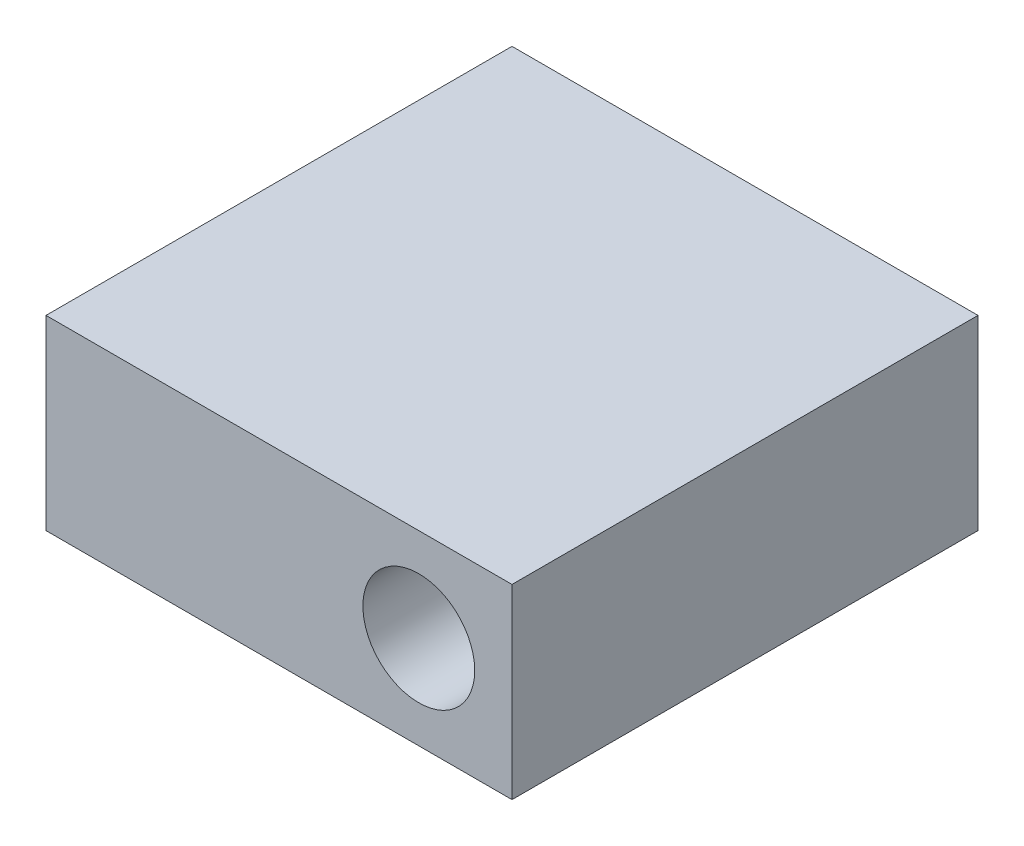
ISO-10303-21;
HEADER;
FILE_DESCRIPTION(('STEP AP214'),'2;1');
FILE_NAME('part.step','',(''),(''),'','','');
FILE_SCHEMA(('AUTOMOTIVE_DESIGN { 1 0 10303 214 1 1 1 1 }'));
ENDSEC;
DATA;
#1=APPLICATION_CONTEXT('core data for automotive mechanical design processes');
#2=APPLICATION_PROTOCOL_DEFINITION('international standard','automotive_design',2000,#1);
#3=PRODUCT_CONTEXT('',#1,'mechanical');
#4=PRODUCT('Part','Part','',(#3));
#5=PRODUCT_RELATED_PRODUCT_CATEGORY('part','',(#4));
#6=PRODUCT_DEFINITION_FORMATION('','',#4);
#7=PRODUCT_DEFINITION_CONTEXT('part definition',#1,'design');
#8=PRODUCT_DEFINITION('design','',#6,#7);
#9=PRODUCT_DEFINITION_SHAPE('','',#8);
#10=(LENGTH_UNIT() NAMED_UNIT(*) SI_UNIT(.MILLI.,.METRE.));
#11=(NAMED_UNIT(*) PLANE_ANGLE_UNIT() SI_UNIT($,.RADIAN.));
#12=(NAMED_UNIT(*) SI_UNIT($,.STERADIAN.) SOLID_ANGLE_UNIT());
#13=UNCERTAINTY_MEASURE_WITH_UNIT(LENGTH_MEASURE(1.E-05),#10,'distance_accuracy_value','');
#14=(GEOMETRIC_REPRESENTATION_CONTEXT(3) GLOBAL_UNCERTAINTY_ASSIGNED_CONTEXT((#13)) GLOBAL_UNIT_ASSIGNED_CONTEXT((#10,
#11,#12)) REPRESENTATION_CONTEXT('',''));
#15=CARTESIAN_POINT('',(0.,0.,0.));
#16=DIRECTION('',(0.,0.,1.));
#17=DIRECTION('',(1.,0.,0.));
#18=AXIS2_PLACEMENT_3D('',#15,#16,#17);
#19=CARTESIAN_POINT('',(12.5,10.,12.5));
#20=DIRECTION('',(-1.,0.,0.));
#21=DIRECTION('',(0.,0.,1.));
#22=AXIS2_PLACEMENT_3D('',#19,#20,#21);
#23=PLANE('',#22);
#24=DIRECTION('',(0.,0.,-1.));
#25=VECTOR('',#24,1.);
#26=CARTESIAN_POINT('',(12.5,0.,12.5));
#27=LINE('',#26,#25);
#28=CARTESIAN_POINT('',(12.5,0.,12.5));
#29=VERTEX_POINT('',#28);
#30=CARTESIAN_POINT('',(12.5,0.,-12.5));
#31=VERTEX_POINT('',#30);
#32=EDGE_CURVE('E107',#29,#31,#27,.T.);
#33=ORIENTED_EDGE('',*,*,#32,.T.);
#34=DIRECTION('',(0.,-1.,0.));
#35=VECTOR('',#34,1.);
#36=CARTESIAN_POINT('',(12.5,10.,-12.5));
#37=LINE('',#36,#35);
#38=CARTESIAN_POINT('',(12.5,10.,-12.5));
#39=VERTEX_POINT('',#38);
#40=EDGE_CURVE('E11',#39,#31,#37,.T.);
#41=ORIENTED_EDGE('',*,*,#40,.F.);
#42=DIRECTION('',(0.,0.,-1.));
#43=VECTOR('',#42,1.);
#44=CARTESIAN_POINT('',(12.5,10.,12.5));
#45=LINE('',#44,#43);
#46=CARTESIAN_POINT('',(12.5,10.,12.5));
#47=VERTEX_POINT('',#46);
#48=EDGE_CURVE('E91',#47,#39,#45,.T.);
#49=ORIENTED_EDGE('',*,*,#48,.F.);
#50=DIRECTION('',(0.,-1.,0.));
#51=VECTOR('',#50,1.);
#52=CARTESIAN_POINT('',(12.5,10.,12.5));
#53=LINE('',#52,#51);
#54=EDGE_CURVE('E103',#47,#29,#53,.T.);
#55=ORIENTED_EDGE('',*,*,#54,.T.);
#56=EDGE_LOOP('',(#33,#41,#49,#55));
#57=FACE_BOUND('',#56,.T.);
#58=ADVANCED_FACE('F39',(#57),#23,.F.);
#59=CARTESIAN_POINT('',(-12.5,10.,-12.5));
#60=DIRECTION('',(0.,0.,1.));
#61=DIRECTION('',(1.,0.,0.));
#62=AXIS2_PLACEMENT_3D('',#59,#60,#61);
#63=PLANE('',#62);
#64=DIRECTION('',(-1.,0.,0.));
#65=VECTOR('',#64,1.);
#66=CARTESIAN_POINT('',(-12.5,0.,-12.5));
#67=LINE('',#66,#65);
#68=CARTESIAN_POINT('',(-12.5,0.,-12.5));
#69=VERTEX_POINT('',#68);
#70=EDGE_CURVE('E96',#31,#69,#67,.T.);
#71=ORIENTED_EDGE('',*,*,#70,.T.);
#72=DIRECTION('',(0.,-1.,0.));
#73=VECTOR('',#72,1.);
#74=CARTESIAN_POINT('',(-12.5,10.,-12.5));
#75=LINE('',#74,#73);
#76=CARTESIAN_POINT('',(-12.5,10.,-12.5));
#77=VERTEX_POINT('',#76);
#78=EDGE_CURVE('E48',#77,#69,#75,.T.);
#79=ORIENTED_EDGE('',*,*,#78,.F.);
#80=DIRECTION('',(-1.,0.,0.));
#81=VECTOR('',#80,1.);
#82=CARTESIAN_POINT('',(-12.5,10.,-12.5));
#83=LINE('',#82,#81);
#84=EDGE_CURVE('E86',#39,#77,#83,.T.);
#85=ORIENTED_EDGE('',*,*,#84,.F.);
#86=ORIENTED_EDGE('',*,*,#40,.T.);
#87=EDGE_LOOP('',(#71,#79,#85,#86));
#88=FACE_BOUND('',#87,.T.);
#89=ADVANCED_FACE('F95',(#88),#63,.F.);
#90=CARTESIAN_POINT('',(-12.5,10.,12.5));
#91=DIRECTION('',(1.,0.,0.));
#92=DIRECTION('',(0.,0.,-1.));
#93=AXIS2_PLACEMENT_3D('',#90,#91,#92);
#94=PLANE('',#93);
#95=DIRECTION('',(0.,0.,1.));
#96=VECTOR('',#95,1.);
#97=CARTESIAN_POINT('',(-12.5,0.,12.5));
#98=LINE('',#97,#96);
#99=CARTESIAN_POINT('',(-12.5,0.,12.5));
#100=VERTEX_POINT('',#99);
#101=EDGE_CURVE('E73',#69,#100,#98,.T.);
#102=ORIENTED_EDGE('',*,*,#101,.T.);
#103=DIRECTION('',(0.,-1.,0.));
#104=VECTOR('',#103,1.);
#105=CARTESIAN_POINT('',(-12.5,10.,12.5));
#106=LINE('',#105,#104);
#107=CARTESIAN_POINT('',(-12.5,10.,12.5));
#108=VERTEX_POINT('',#107);
#109=EDGE_CURVE('E98',#108,#100,#106,.T.);
#110=ORIENTED_EDGE('',*,*,#109,.F.);
#111=DIRECTION('',(0.,0.,1.));
#112=VECTOR('',#111,1.);
#113=CARTESIAN_POINT('',(-12.5,10.,12.5));
#114=LINE('',#113,#112);
#115=EDGE_CURVE('E89',#77,#108,#114,.T.);
#116=ORIENTED_EDGE('',*,*,#115,.F.);
#117=ORIENTED_EDGE('',*,*,#78,.T.);
#118=EDGE_LOOP('',(#102,#110,#116,#117));
#119=FACE_BOUND('',#118,.T.);
#120=ADVANCED_FACE('F99',(#119),#94,.F.);
#121=CARTESIAN_POINT('',(-12.5,10.,12.5));
#122=DIRECTION('',(0.,0.,-1.));
#123=DIRECTION('',(-1.,0.,0.));
#124=AXIS2_PLACEMENT_3D('',#121,#122,#123);
#125=PLANE('',#124);
#126=CARTESIAN_POINT('',(7.5,5.,12.5));
#127=DIRECTION('',(0.,0.,1.));
#128=DIRECTION('',(1.,0.,0.));
#129=AXIS2_PLACEMENT_3D('',#126,#127,#128);
#130=CIRCLE('',#129,3.);
#131=CARTESIAN_POINT('',(10.5,5.,12.5));
#132=VERTEX_POINT('',#131);
#133=EDGE_CURVE('E128',#132,#132,#130,.T.);
#134=ORIENTED_EDGE('',*,*,#133,.F.);
#135=EDGE_LOOP('',(#134));
#136=FACE_BOUND('',#135,.T.);
#137=DIRECTION('',(1.,0.,0.));
#138=VECTOR('',#137,1.);
#139=CARTESIAN_POINT('',(-12.5,0.,12.5));
#140=LINE('',#139,#138);
#141=EDGE_CURVE('E79',#100,#29,#140,.T.);
#142=ORIENTED_EDGE('',*,*,#141,.T.);
#143=ORIENTED_EDGE('',*,*,#54,.F.);
#144=DIRECTION('',(1.,0.,0.));
#145=VECTOR('',#144,1.);
#146=CARTESIAN_POINT('',(-12.5,10.,12.5));
#147=LINE('',#146,#145);
#148=EDGE_CURVE('E56',#108,#47,#147,.T.);
#149=ORIENTED_EDGE('',*,*,#148,.F.);
#150=ORIENTED_EDGE('',*,*,#109,.T.);
#151=EDGE_LOOP('',(#142,#143,#149,#150));
#152=FACE_BOUND('',#151,.T.);
#153=ADVANCED_FACE('F121',(#136,#152),#125,.F.);
#154=CARTESIAN_POINT('',(0.,10.,0.));
#155=DIRECTION('',(0.,-1.,0.));
#156=DIRECTION('',(0.,0.,-1.));
#157=AXIS2_PLACEMENT_3D('',#154,#155,#156);
#158=PLANE('',#157);
#159=ORIENTED_EDGE('',*,*,#48,.T.);
#160=ORIENTED_EDGE('',*,*,#84,.T.);
#161=ORIENTED_EDGE('',*,*,#115,.T.);
#162=ORIENTED_EDGE('',*,*,#148,.T.);
#163=EDGE_LOOP('',(#159,#160,#161,#162));
#164=FACE_BOUND('',#163,.T.);
#165=ADVANCED_FACE('F87',(#164),#158,.F.);
#166=CARTESIAN_POINT('',(0.,0.,0.));
#167=DIRECTION('',(0.,-1.,0.));
#168=DIRECTION('',(0.,0.,-1.));
#169=AXIS2_PLACEMENT_3D('',#166,#167,#168);
#170=PLANE('',#169);
#171=ORIENTED_EDGE('',*,*,#32,.F.);
#172=ORIENTED_EDGE('',*,*,#141,.F.);
#173=ORIENTED_EDGE('',*,*,#101,.F.);
#174=ORIENTED_EDGE('',*,*,#70,.F.);
#175=EDGE_LOOP('',(#171,#172,#173,#174));
#176=FACE_BOUND('',#175,.T.);
#177=ADVANCED_FACE('F124',(#176),#170,.T.);
#178=CARTESIAN_POINT('',(7.5,5.,2.5));
#179=DIRECTION('',(0.,0.,1.));
#180=DIRECTION('',(1.,0.,0.));
#181=AXIS2_PLACEMENT_3D('',#178,#179,#180);
#182=CYLINDRICAL_SURFACE('',#181,3.);
#183=CARTESIAN_POINT('',(7.5,5.,2.5));
#184=DIRECTION('',(0.,0.,1.));
#185=DIRECTION('',(1.,0.,0.));
#186=AXIS2_PLACEMENT_3D('',#183,#184,#185);
#187=CIRCLE('',#186,3.);
#188=CARTESIAN_POINT('',(10.5,5.,2.5));
#189=VERTEX_POINT('',#188);
#190=EDGE_CURVE('E111',#189,#189,#187,.T.);
#191=ORIENTED_EDGE('',*,*,#190,.F.);
#192=EDGE_LOOP('',(#191));
#193=FACE_BOUND('',#192,.T.);
#194=ORIENTED_EDGE('',*,*,#133,.T.);
#195=EDGE_LOOP('',(#194));
#196=FACE_BOUND('',#195,.T.);
#197=ADVANCED_FACE('F138',(#193,#196),#182,.F.);
#198=CARTESIAN_POINT('',(7.5,5.,2.5));
#199=DIRECTION('',(0.,0.,1.));
#200=DIRECTION('',(1.,0.,0.));
#201=AXIS2_PLACEMENT_3D('',#198,#199,#200);
#202=PLANE('',#201);
#203=ORIENTED_EDGE('',*,*,#190,.T.);
#204=EDGE_LOOP('',(#203));
#205=FACE_BOUND('',#204,.T.);
#206=ADVANCED_FACE('F136',(#205),#202,.T.);
#207=CLOSED_SHELL('',(#58,#89,#120,#153,#165,#177,#197,#206));
#208=MANIFOLD_SOLID_BREP('B2',#207);
#209=ADVANCED_BREP_SHAPE_REPRESENTATION('',(#18,#208),#14);
#210=SHAPE_DEFINITION_REPRESENTATION(#9,#209);
ENDSEC;
END-ISO-10303-21;
